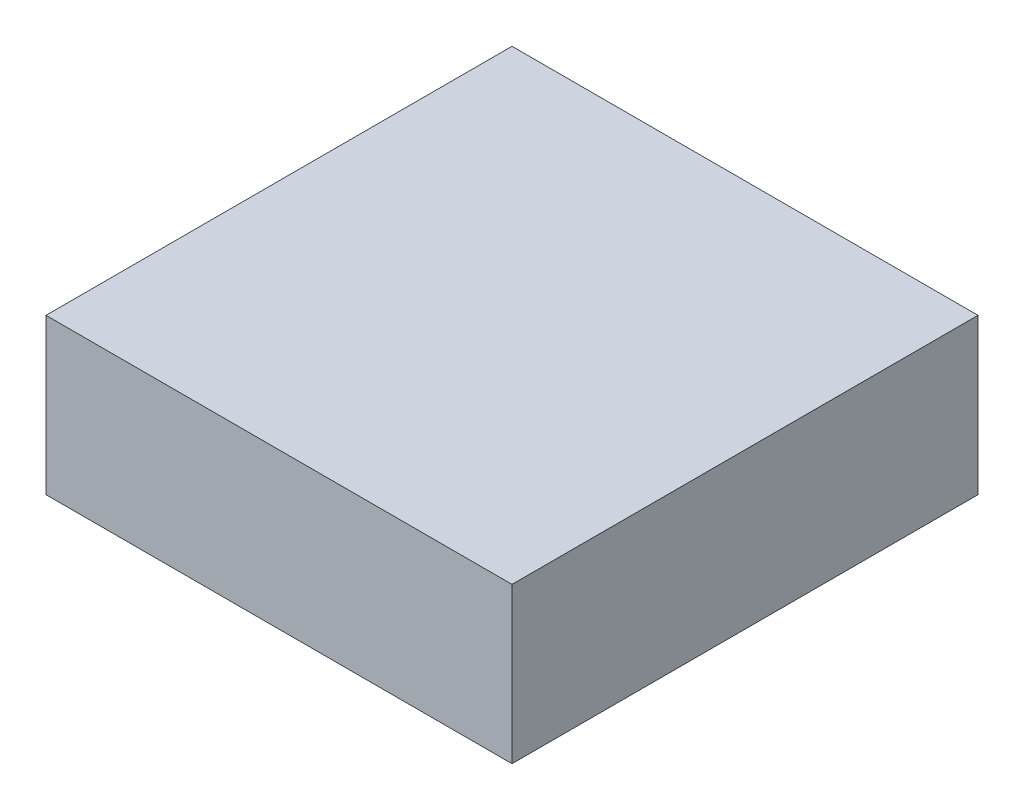
ISO-10303-21;
HEADER;
FILE_DESCRIPTION(('STEP AP214'),'2;1');
FILE_NAME('part.step','',(''),(''),'','','');
FILE_SCHEMA(('AUTOMOTIVE_DESIGN { 1 0 10303 214 1 1 1 1 }'));
ENDSEC;
DATA;
#1=APPLICATION_CONTEXT('core data for automotive mechanical design processes');
#2=APPLICATION_PROTOCOL_DEFINITION('international standard','automotive_design',2000,#1);
#3=PRODUCT_CONTEXT('',#1,'mechanical');
#4=PRODUCT('Part','Part','',(#3));
#5=PRODUCT_RELATED_PRODUCT_CATEGORY('part','',(#4));
#6=PRODUCT_DEFINITION_FORMATION('','',#4);
#7=PRODUCT_DEFINITION_CONTEXT('part definition',#1,'design');
#8=PRODUCT_DEFINITION('design','',#6,#7);
#9=PRODUCT_DEFINITION_SHAPE('','',#8);
#10=(LENGTH_UNIT() NAMED_UNIT(*) SI_UNIT(.MILLI.,.METRE.));
#11=(NAMED_UNIT(*) PLANE_ANGLE_UNIT() SI_UNIT($,.RADIAN.));
#12=(NAMED_UNIT(*) SI_UNIT($,.STERADIAN.) SOLID_ANGLE_UNIT());
#13=UNCERTAINTY_MEASURE_WITH_UNIT(LENGTH_MEASURE(1.E-05),#10,'distance_accuracy_value','');
#14=(GEOMETRIC_REPRESENTATION_CONTEXT(3) GLOBAL_UNCERTAINTY_ASSIGNED_CONTEXT((#13)) GLOBAL_UNIT_ASSIGNED_CONTEXT((#10,
#11,#12)) REPRESENTATION_CONTEXT('',''));
#15=CARTESIAN_POINT('',(0.,0.,0.));
#16=DIRECTION('',(0.,0.,1.));
#17=DIRECTION('',(1.,0.,0.));
#18=AXIS2_PLACEMENT_3D('',#15,#16,#17);
#19=CARTESIAN_POINT('',(0.,12.,36.));
#20=DIRECTION('',(1.,0.,0.));
#21=DIRECTION('',(0.,0.,-1.));
#22=AXIS2_PLACEMENT_3D('',#19,#20,#21);
#23=PLANE('',#22);
#24=DIRECTION('',(0.,-1.,0.));
#25=VECTOR('',#24,1.);
#26=CARTESIAN_POINT('',(0.,12.,0.));
#27=LINE('',#26,#25);
#28=CARTESIAN_POINT('',(0.,12.,0.));
#29=VERTEX_POINT('',#28);
#30=CARTESIAN_POINT('',(0.,0.,0.));
#31=VERTEX_POINT('',#30);
#32=EDGE_CURVE('E102',#29,#31,#27,.T.);
#33=ORIENTED_EDGE('',*,*,#32,.T.);
#34=DIRECTION('',(0.,0.,-1.));
#35=VECTOR('',#34,1.);
#36=CARTESIAN_POINT('',(0.,0.,36.));
#37=LINE('',#36,#35);
#38=CARTESIAN_POINT('',(0.,0.,36.));
#39=VERTEX_POINT('',#38);
#40=EDGE_CURVE('E11',#39,#31,#37,.T.);
#41=ORIENTED_EDGE('',*,*,#40,.F.);
#42=DIRECTION('',(0.,-1.,0.));
#43=VECTOR('',#42,1.);
#44=CARTESIAN_POINT('',(0.,12.,36.));
#45=LINE('',#44,#43);
#46=CARTESIAN_POINT('',(0.,12.,36.));
#47=VERTEX_POINT('',#46);
#48=EDGE_CURVE('E90',#47,#39,#45,.T.);
#49=ORIENTED_EDGE('',*,*,#48,.F.);
#50=DIRECTION('',(0.,0.,-1.));
#51=VECTOR('',#50,1.);
#52=CARTESIAN_POINT('',(0.,12.,36.));
#53=LINE('',#52,#51);
#54=EDGE_CURVE('E98',#47,#29,#53,.T.);
#55=ORIENTED_EDGE('',*,*,#54,.T.);
#56=EDGE_LOOP('',(#33,#41,#49,#55));
#57=FACE_BOUND('',#56,.T.);
#58=ADVANCED_FACE('F39',(#57),#23,.F.);
#59=CARTESIAN_POINT('',(0.,0.,36.));
#60=DIRECTION('',(0.,1.,0.));
#61=DIRECTION('',(0.,0.,1.));
#62=AXIS2_PLACEMENT_3D('',#59,#60,#61);
#63=PLANE('',#62);
#64=DIRECTION('',(1.,0.,0.));
#65=VECTOR('',#64,1.);
#66=CARTESIAN_POINT('',(0.,0.,0.));
#67=LINE('',#66,#65);
#68=CARTESIAN_POINT('',(36.,0.,0.));
#69=VERTEX_POINT('',#68);
#70=EDGE_CURVE('E94',#31,#69,#67,.T.);
#71=ORIENTED_EDGE('',*,*,#70,.T.);
#72=DIRECTION('',(0.,0.,-1.));
#73=VECTOR('',#72,1.);
#74=CARTESIAN_POINT('',(36.,0.,36.));
#75=LINE('',#74,#73);
#76=CARTESIAN_POINT('',(36.,0.,36.));
#77=VERTEX_POINT('',#76);
#78=EDGE_CURVE('E47',#77,#69,#75,.T.);
#79=ORIENTED_EDGE('',*,*,#78,.F.);
#80=DIRECTION('',(1.,0.,0.));
#81=VECTOR('',#80,1.);
#82=CARTESIAN_POINT('',(0.,0.,36.));
#83=LINE('',#82,#81);
#84=EDGE_CURVE('E85',#39,#77,#83,.T.);
#85=ORIENTED_EDGE('',*,*,#84,.F.);
#86=ORIENTED_EDGE('',*,*,#40,.T.);
#87=EDGE_LOOP('',(#71,#79,#85,#86));
#88=FACE_BOUND('',#87,.T.);
#89=ADVANCED_FACE('F93',(#88),#63,.F.);
#90=CARTESIAN_POINT('',(36.,0.,36.));
#91=DIRECTION('',(-1.,0.,0.));
#92=DIRECTION('',(0.,0.,1.));
#93=AXIS2_PLACEMENT_3D('',#90,#91,#92);
#94=PLANE('',#93);
#95=DIRECTION('',(0.,1.,0.));
#96=VECTOR('',#95,1.);
#97=CARTESIAN_POINT('',(36.,0.,0.));
#98=LINE('',#97,#96);
#99=CARTESIAN_POINT('',(36.,12.,0.));
#100=VERTEX_POINT('',#99);
#101=EDGE_CURVE('E72',#69,#100,#98,.T.);
#102=ORIENTED_EDGE('',*,*,#101,.T.);
#103=DIRECTION('',(0.,0.,-1.));
#104=VECTOR('',#103,1.);
#105=CARTESIAN_POINT('',(36.,12.,36.));
#106=LINE('',#105,#104);
#107=CARTESIAN_POINT('',(36.,12.,36.));
#108=VERTEX_POINT('',#107);
#109=EDGE_CURVE('E95',#108,#100,#106,.T.);
#110=ORIENTED_EDGE('',*,*,#109,.F.);
#111=DIRECTION('',(0.,1.,0.));
#112=VECTOR('',#111,1.);
#113=CARTESIAN_POINT('',(36.,0.,36.));
#114=LINE('',#113,#112);
#115=EDGE_CURVE('E88',#77,#108,#114,.T.);
#116=ORIENTED_EDGE('',*,*,#115,.F.);
#117=ORIENTED_EDGE('',*,*,#78,.T.);
#118=EDGE_LOOP('',(#102,#110,#116,#117));
#119=FACE_BOUND('',#118,.T.);
#120=ADVANCED_FACE('F96',(#119),#94,.F.);
#121=CARTESIAN_POINT('',(36.,12.,36.));
#122=DIRECTION('',(0.,-1.,0.));
#123=DIRECTION('',(0.,0.,-1.));
#124=AXIS2_PLACEMENT_3D('',#121,#122,#123);
#125=PLANE('',#124);
#126=DIRECTION('',(-1.,0.,0.));
#127=VECTOR('',#126,1.);
#128=CARTESIAN_POINT('',(36.,12.,0.));
#129=LINE('',#128,#127);
#130=EDGE_CURVE('E78',#100,#29,#129,.T.);
#131=ORIENTED_EDGE('',*,*,#130,.T.);
#132=ORIENTED_EDGE('',*,*,#54,.F.);
#133=DIRECTION('',(-1.,0.,0.));
#134=VECTOR('',#133,1.);
#135=CARTESIAN_POINT('',(36.,12.,36.));
#136=LINE('',#135,#134);
#137=EDGE_CURVE('E55',#108,#47,#136,.T.);
#138=ORIENTED_EDGE('',*,*,#137,.F.);
#139=ORIENTED_EDGE('',*,*,#109,.T.);
#140=EDGE_LOOP('',(#131,#132,#138,#139));
#141=FACE_BOUND('',#140,.T.);
#142=ADVANCED_FACE('F109',(#141),#125,.F.);
#143=CARTESIAN_POINT('',(0.,0.,36.));
#144=DIRECTION('',(0.,0.,1.));
#145=DIRECTION('',(1.,0.,0.));
#146=AXIS2_PLACEMENT_3D('',#143,#144,#145);
#147=PLANE('',#146);
#148=ORIENTED_EDGE('',*,*,#48,.T.);
#149=ORIENTED_EDGE('',*,*,#84,.T.);
#150=ORIENTED_EDGE('',*,*,#115,.T.);
#151=ORIENTED_EDGE('',*,*,#137,.T.);
#152=EDGE_LOOP('',(#148,#149,#150,#151));
#153=FACE_BOUND('',#152,.T.);
#154=ADVANCED_FACE('F86',(#153),#147,.T.);
#155=CARTESIAN_POINT('',(0.,0.,0.));
#156=DIRECTION('',(0.,0.,1.));
#157=DIRECTION('',(1.,0.,0.));
#158=AXIS2_PLACEMENT_3D('',#155,#156,#157);
#159=PLANE('',#158);
#160=ORIENTED_EDGE('',*,*,#32,.F.);
#161=ORIENTED_EDGE('',*,*,#130,.F.);
#162=ORIENTED_EDGE('',*,*,#101,.F.);
#163=ORIENTED_EDGE('',*,*,#70,.F.);
#164=EDGE_LOOP('',(#160,#161,#162,#163));
#165=FACE_BOUND('',#164,.T.);
#166=ADVANCED_FACE('F112',(#165),#159,.F.);
#167=CLOSED_SHELL('',(#58,#89,#120,#142,#154,#166));
#168=MANIFOLD_SOLID_BREP('B2',#167);
#169=ADVANCED_BREP_SHAPE_REPRESENTATION('',(#18,#168),#14);
#170=SHAPE_DEFINITION_REPRESENTATION(#9,#169);
ENDSEC;
END-ISO-10303-21;
